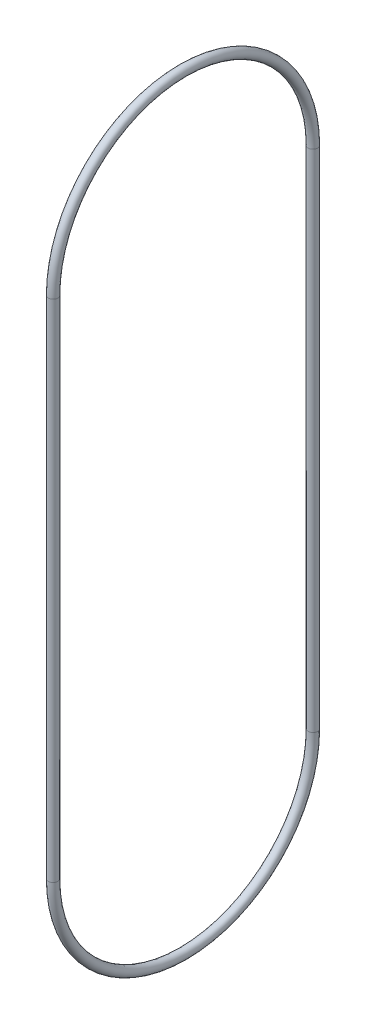
ISO-10303-21;
HEADER;
FILE_DESCRIPTION(('STEP AP214'),'2;1');
FILE_NAME('part.step','',(''),(''),'','','');
FILE_SCHEMA(('AUTOMOTIVE_DESIGN { 1 0 10303 214 1 1 1 1 }'));
ENDSEC;
DATA;
#1=APPLICATION_CONTEXT('core data for automotive mechanical design processes');
#2=APPLICATION_PROTOCOL_DEFINITION('international standard','automotive_design',2000,#1);
#3=PRODUCT_CONTEXT('',#1,'mechanical');
#4=PRODUCT('Part','Part','',(#3));
#5=PRODUCT_RELATED_PRODUCT_CATEGORY('part','',(#4));
#6=PRODUCT_DEFINITION_FORMATION('','',#4);
#7=PRODUCT_DEFINITION_CONTEXT('part definition',#1,'design');
#8=PRODUCT_DEFINITION('design','',#6,#7);
#9=PRODUCT_DEFINITION_SHAPE('','',#8);
#10=(LENGTH_UNIT() NAMED_UNIT(*) SI_UNIT(.MILLI.,.METRE.));
#11=(NAMED_UNIT(*) PLANE_ANGLE_UNIT() SI_UNIT($,.RADIAN.));
#12=(NAMED_UNIT(*) SI_UNIT($,.STERADIAN.) SOLID_ANGLE_UNIT());
#13=UNCERTAINTY_MEASURE_WITH_UNIT(LENGTH_MEASURE(1.E-05),#10,'distance_accuracy_value','');
#14=(GEOMETRIC_REPRESENTATION_CONTEXT(3) GLOBAL_UNCERTAINTY_ASSIGNED_CONTEXT((#13)) GLOBAL_UNIT_ASSIGNED_CONTEXT((#10,
#11,#12)) REPRESENTATION_CONTEXT('',''));
#15=CARTESIAN_POINT('',(0.,0.,0.));
#16=DIRECTION('',(0.,0.,1.));
#17=DIRECTION('',(1.,0.,0.));
#18=AXIS2_PLACEMENT_3D('',#15,#16,#17);
#19=CARTESIAN_POINT('',(0.,0.,0.));
#20=DIRECTION('',(-1.,0.,0.));
#21=DIRECTION('',(0.,0.,1.));
#22=AXIS2_PLACEMENT_3D('',#19,#20,#21);
#23=TOROIDAL_SURFACE('',#22,32.54375,1.190625);
#24=CARTESIAN_POINT('',(0.,0.,-32.54375));
#25=DIRECTION('',(0.,-1.,0.));
#26=DIRECTION('',(0.,0.,-1.));
#27=AXIS2_PLACEMENT_3D('',#24,#25,#26);
#28=CIRCLE('',#27,1.190625);
#29=CARTESIAN_POINT('',(0.,0.,-33.734375));
#30=VERTEX_POINT('',#29);
#31=EDGE_CURVE('E10',#30,#30,#28,.T.);
#32=CARTESIAN_POINT('',(0.,0.,32.54375));
#33=DIRECTION('',(0.,1.,0.));
#34=DIRECTION('',(0.,0.,1.));
#35=AXIS2_PLACEMENT_3D('',#32,#33,#34);
#36=CIRCLE('',#35,1.190625);
#37=CARTESIAN_POINT('',(0.,0.,33.734375));
#38=VERTEX_POINT('',#37);
#39=EDGE_CURVE('E47',#38,#38,#36,.T.);
#40=CARTESIAN_POINT('',(0.,0.,0.));
#41=DIRECTION('',(-1.,0.,0.));
#42=DIRECTION('',(0.,0.,1.));
#43=AXIS2_PLACEMENT_3D('',#40,#41,#42);
#44=CIRCLE('',#43,33.734375);
#45=EDGE_CURVE('',#30,#38,#44,.T.);
#46=ORIENTED_EDGE('',*,*,#31,.T.);
#47=ORIENTED_EDGE('',*,*,#39,.F.);
#48=ORIENTED_EDGE('',*,*,#45,.T.);
#49=ORIENTED_EDGE('',*,*,#45,.F.);
#50=EDGE_LOOP('',(#46,#48,#47,#49));
#51=FACE_BOUND('',#50,.T.);
#52=ADVANCED_FACE('F33',(#51),#23,.T.);
#53=CARTESIAN_POINT('',(0.,126.548151272,-32.54375));
#54=DIRECTION('',(0.,-1.,0.));
#55=DIRECTION('',(0.,0.,-1.));
#56=AXIS2_PLACEMENT_3D('',#53,#54,#55);
#57=CYLINDRICAL_SURFACE('',#56,1.190625);
#58=ORIENTED_EDGE('',*,*,#31,.F.);
#59=EDGE_LOOP('',(#58));
#60=FACE_BOUND('',#59,.T.);
#61=CARTESIAN_POINT('',(0.,126.548151272,-32.54375));
#62=DIRECTION('',(0.,-1.,0.));
#63=DIRECTION('',(0.,0.,-1.));
#64=AXIS2_PLACEMENT_3D('',#61,#62,#63);
#65=CIRCLE('',#64,1.190625);
#66=CARTESIAN_POINT('',(0.,126.548151272,-33.734375));
#67=VERTEX_POINT('',#66);
#68=EDGE_CURVE('E39',#67,#67,#65,.T.);
#69=ORIENTED_EDGE('',*,*,#68,.T.);
#70=EDGE_LOOP('',(#69));
#71=FACE_BOUND('',#70,.T.);
#72=ADVANCED_FACE('F56',(#60,#71),#57,.T.);
#73=CARTESIAN_POINT('',(0.,126.548151272,0.));
#74=DIRECTION('',(-1.,0.,0.));
#75=DIRECTION('',(0.,0.,1.));
#76=AXIS2_PLACEMENT_3D('',#73,#74,#75);
#77=TOROIDAL_SURFACE('',#76,32.54375,1.190625);
#78=CARTESIAN_POINT('',(0.,126.548151272,32.54375));
#79=DIRECTION('',(0.,1.,0.));
#80=DIRECTION('',(0.,0.,1.));
#81=AXIS2_PLACEMENT_3D('',#78,#79,#80);
#82=CIRCLE('',#81,1.190625);
#83=CARTESIAN_POINT('',(0.,126.548151272,33.734375));
#84=VERTEX_POINT('',#83);
#85=EDGE_CURVE('E43',#84,#84,#82,.T.);
#86=CARTESIAN_POINT('',(0.,126.548151272,0.));
#87=DIRECTION('',(-1.,0.,0.));
#88=DIRECTION('',(0.,0.,1.));
#89=AXIS2_PLACEMENT_3D('',#86,#87,#88);
#90=CIRCLE('',#89,33.734375);
#91=EDGE_CURVE('',#84,#67,#90,.T.);
#92=ORIENTED_EDGE('',*,*,#85,.T.);
#93=ORIENTED_EDGE('',*,*,#68,.F.);
#94=ORIENTED_EDGE('',*,*,#91,.T.);
#95=ORIENTED_EDGE('',*,*,#91,.F.);
#96=EDGE_LOOP('',(#92,#94,#93,#95));
#97=FACE_BOUND('',#96,.T.);
#98=ADVANCED_FACE('F60',(#97),#77,.T.);
#99=CARTESIAN_POINT('',(0.,0.,32.54375));
#100=DIRECTION('',(0.,1.,0.));
#101=DIRECTION('',(0.,0.,1.));
#102=AXIS2_PLACEMENT_3D('',#99,#100,#101);
#103=CYLINDRICAL_SURFACE('',#102,1.190625);
#104=ORIENTED_EDGE('',*,*,#85,.F.);
#105=EDGE_LOOP('',(#104));
#106=FACE_BOUND('',#105,.T.);
#107=ORIENTED_EDGE('',*,*,#39,.T.);
#108=EDGE_LOOP('',(#107));
#109=FACE_BOUND('',#108,.T.);
#110=ADVANCED_FACE('F53',(#106,#109),#103,.T.);
#111=CLOSED_SHELL('',(#52,#72,#98,#110));
#112=MANIFOLD_SOLID_BREP('B2',#111);
#113=ADVANCED_BREP_SHAPE_REPRESENTATION('',(#18,#112),#14);
#114=SHAPE_DEFINITION_REPRESENTATION(#9,#113);
ENDSEC;
END-ISO-10303-21;
